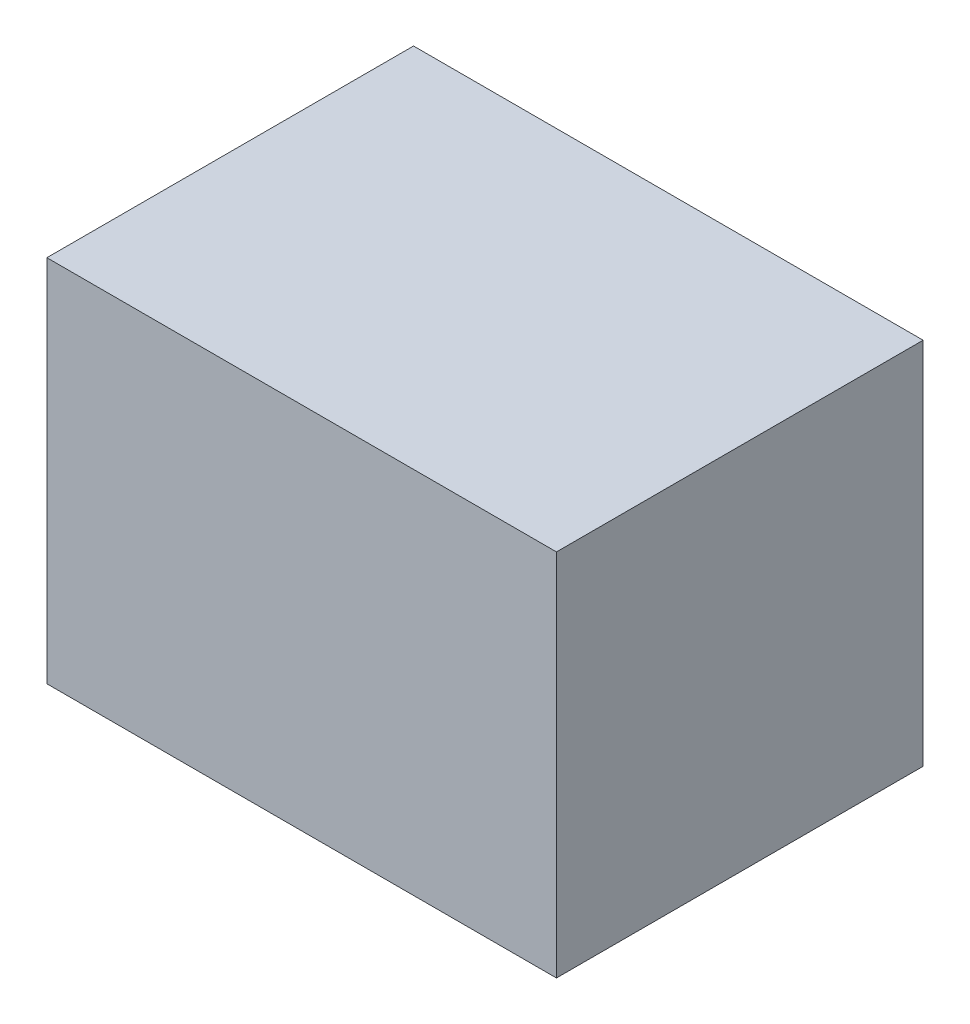
ISO-10303-21;
HEADER;
FILE_DESCRIPTION(('STEP AP214'),'2;1');
FILE_NAME('part.step','',(''),(''),'','','');
FILE_SCHEMA(('AUTOMOTIVE_DESIGN { 1 0 10303 214 1 1 1 1 }'));
ENDSEC;
DATA;
#1=APPLICATION_CONTEXT('core data for automotive mechanical design processes');
#2=APPLICATION_PROTOCOL_DEFINITION('international standard','automotive_design',2000,#1);
#3=PRODUCT_CONTEXT('',#1,'mechanical');
#4=PRODUCT('Part','Part','',(#3));
#5=PRODUCT_RELATED_PRODUCT_CATEGORY('part','',(#4));
#6=PRODUCT_DEFINITION_FORMATION('','',#4);
#7=PRODUCT_DEFINITION_CONTEXT('part definition',#1,'design');
#8=PRODUCT_DEFINITION('design','',#6,#7);
#9=PRODUCT_DEFINITION_SHAPE('','',#8);
#10=(LENGTH_UNIT() NAMED_UNIT(*) SI_UNIT(.MILLI.,.METRE.));
#11=(NAMED_UNIT(*) PLANE_ANGLE_UNIT() SI_UNIT($,.RADIAN.));
#12=(NAMED_UNIT(*) SI_UNIT($,.STERADIAN.) SOLID_ANGLE_UNIT());
#13=UNCERTAINTY_MEASURE_WITH_UNIT(LENGTH_MEASURE(1.E-05),#10,'distance_accuracy_value','');
#14=(GEOMETRIC_REPRESENTATION_CONTEXT(3) GLOBAL_UNCERTAINTY_ASSIGNED_CONTEXT((#13)) GLOBAL_UNIT_ASSIGNED_CONTEXT((#10,
#11,#12)) REPRESENTATION_CONTEXT('',''));
#15=CARTESIAN_POINT('',(0.,0.,0.));
#16=DIRECTION('',(0.,0.,1.));
#17=DIRECTION('',(1.,0.,0.));
#18=AXIS2_PLACEMENT_3D('',#15,#16,#17);
#19=CARTESIAN_POINT('',(-0.3683,-0.2667,0.));
#20=DIRECTION('',(0.,0.,1.));
#21=DIRECTION('',(1.,0.,0.));
#22=AXIS2_PLACEMENT_3D('',#19,#20,#21);
#23=PLANE('',#22);
#24=DIRECTION('',(-1.,0.,0.));
#25=VECTOR('',#24,1.);
#26=CARTESIAN_POINT('',(-0.3683,0.2667,0.));
#27=LINE('',#26,#25);
#28=CARTESIAN_POINT('',(0.3683,0.2667,0.));
#29=VERTEX_POINT('',#28);
#30=CARTESIAN_POINT('',(-0.3683,0.2667,0.));
#31=VERTEX_POINT('',#30);
#32=EDGE_CURVE('E67',#29,#31,#27,.T.);
#33=ORIENTED_EDGE('',*,*,#32,.F.);
#34=DIRECTION('',(0.,1.,0.));
#35=VECTOR('',#34,1.);
#36=CARTESIAN_POINT('',(0.3683,-0.2667,0.));
#37=LINE('',#36,#35);
#38=CARTESIAN_POINT('',(0.3683,-0.2667,0.));
#39=VERTEX_POINT('',#38);
#40=EDGE_CURVE('E61',#39,#29,#37,.T.);
#41=ORIENTED_EDGE('',*,*,#40,.F.);
#42=DIRECTION('',(1.,0.,0.));
#43=VECTOR('',#42,1.);
#44=CARTESIAN_POINT('',(-0.3683,-0.2667,0.));
#45=LINE('',#44,#43);
#46=CARTESIAN_POINT('',(-0.3683,-0.2667,0.));
#47=VERTEX_POINT('',#46);
#48=EDGE_CURVE('E64',#47,#39,#45,.T.);
#49=ORIENTED_EDGE('',*,*,#48,.F.);
#50=DIRECTION('',(0.,-1.,0.));
#51=VECTOR('',#50,1.);
#52=CARTESIAN_POINT('',(-0.3683,-0.2667,0.));
#53=LINE('',#52,#51);
#54=EDGE_CURVE('E11',#31,#47,#53,.T.);
#55=ORIENTED_EDGE('',*,*,#54,.F.);
#56=EDGE_LOOP('',(#33,#41,#49,#55));
#57=FACE_BOUND('',#56,.T.);
#58=ADVANCED_FACE('F16',(#57),#23,.F.);
#59=CARTESIAN_POINT('',(-0.3683,-0.2667,0.));
#60=DIRECTION('',(-1.,0.,0.));
#61=DIRECTION('',(0.,0.,1.));
#62=AXIS2_PLACEMENT_3D('',#59,#60,#61);
#63=PLANE('',#62);
#64=DIRECTION('',(0.,0.,-1.));
#65=VECTOR('',#64,1.);
#66=CARTESIAN_POINT('',(-0.3683,0.2667,0.));
#67=LINE('',#66,#65);
#68=CARTESIAN_POINT('',(-0.3683,0.2667,0.53));
#69=VERTEX_POINT('',#68);
#70=EDGE_CURVE('E27',#69,#31,#67,.T.);
#71=ORIENTED_EDGE('',*,*,#70,.T.);
#72=ORIENTED_EDGE('',*,*,#54,.T.);
#73=DIRECTION('',(0.,0.,1.));
#74=VECTOR('',#73,1.);
#75=CARTESIAN_POINT('',(-0.3683,-0.2667,0.));
#76=LINE('',#75,#74);
#77=CARTESIAN_POINT('',(-0.3683,-0.2667,0.53));
#78=VERTEX_POINT('',#77);
#79=EDGE_CURVE('E20',#47,#78,#76,.T.);
#80=ORIENTED_EDGE('',*,*,#79,.T.);
#81=DIRECTION('',(0.,1.,0.));
#82=VECTOR('',#81,1.);
#83=CARTESIAN_POINT('',(-0.3683,-0.2667,0.53));
#84=LINE('',#83,#82);
#85=EDGE_CURVE('E93',#78,#69,#84,.T.);
#86=ORIENTED_EDGE('',*,*,#85,.T.);
#87=EDGE_LOOP('',(#71,#72,#80,#86));
#88=FACE_BOUND('',#87,.T.);
#89=ADVANCED_FACE('F121',(#88),#63,.T.);
#90=CARTESIAN_POINT('',(-0.3683,0.2667,0.));
#91=DIRECTION('',(0.,1.,0.));
#92=DIRECTION('',(1.,0.,0.));
#93=AXIS2_PLACEMENT_3D('',#90,#91,#92);
#94=PLANE('',#93);
#95=DIRECTION('',(0.,0.,-1.));
#96=VECTOR('',#95,1.);
#97=CARTESIAN_POINT('',(0.3683,0.2667,0.));
#98=LINE('',#97,#96);
#99=CARTESIAN_POINT('',(0.3683,0.2667,0.53));
#100=VERTEX_POINT('',#99);
#101=EDGE_CURVE('E71',#100,#29,#98,.T.);
#102=ORIENTED_EDGE('',*,*,#101,.T.);
#103=ORIENTED_EDGE('',*,*,#32,.T.);
#104=ORIENTED_EDGE('',*,*,#70,.F.);
#105=DIRECTION('',(1.,0.,0.));
#106=VECTOR('',#105,1.);
#107=CARTESIAN_POINT('',(-0.3683,0.2667,0.53));
#108=LINE('',#107,#106);
#109=EDGE_CURVE('E98',#69,#100,#108,.T.);
#110=ORIENTED_EDGE('',*,*,#109,.T.);
#111=EDGE_LOOP('',(#102,#103,#104,#110));
#112=FACE_BOUND('',#111,.T.);
#113=ADVANCED_FACE('F124',(#112),#94,.T.);
#114=CARTESIAN_POINT('',(0.3683,0.2667,0.));
#115=DIRECTION('',(1.,0.,0.));
#116=DIRECTION('',(0.,1.,0.));
#117=AXIS2_PLACEMENT_3D('',#114,#115,#116);
#118=PLANE('',#117);
#119=DIRECTION('',(0.,0.,-1.));
#120=VECTOR('',#119,1.);
#121=CARTESIAN_POINT('',(0.3683,-0.2667,0.));
#122=LINE('',#121,#120);
#123=CARTESIAN_POINT('',(0.3683,-0.2667,0.53));
#124=VERTEX_POINT('',#123);
#125=EDGE_CURVE('E72',#124,#39,#122,.T.);
#126=ORIENTED_EDGE('',*,*,#125,.T.);
#127=ORIENTED_EDGE('',*,*,#40,.T.);
#128=ORIENTED_EDGE('',*,*,#101,.F.);
#129=DIRECTION('',(0.,-1.,0.));
#130=VECTOR('',#129,1.);
#131=CARTESIAN_POINT('',(0.3683,0.2667,0.53));
#132=LINE('',#131,#130);
#133=EDGE_CURVE('E77',#100,#124,#132,.T.);
#134=ORIENTED_EDGE('',*,*,#133,.T.);
#135=EDGE_LOOP('',(#126,#127,#128,#134));
#136=FACE_BOUND('',#135,.T.);
#137=ADVANCED_FACE('F18',(#136),#118,.T.);
#138=CARTESIAN_POINT('',(0.3683,-0.2667,0.));
#139=DIRECTION('',(0.,-1.,0.));
#140=DIRECTION('',(0.,0.,-1.));
#141=AXIS2_PLACEMENT_3D('',#138,#139,#140);
#142=PLANE('',#141);
#143=ORIENTED_EDGE('',*,*,#79,.F.);
#144=ORIENTED_EDGE('',*,*,#48,.T.);
#145=ORIENTED_EDGE('',*,*,#125,.F.);
#146=DIRECTION('',(-1.,0.,0.));
#147=VECTOR('',#146,1.);
#148=CARTESIAN_POINT('',(0.3683,-0.2667,0.53));
#149=LINE('',#148,#147);
#150=EDGE_CURVE('E96',#124,#78,#149,.T.);
#151=ORIENTED_EDGE('',*,*,#150,.T.);
#152=EDGE_LOOP('',(#143,#144,#145,#151));
#153=FACE_BOUND('',#152,.T.);
#154=ADVANCED_FACE('F83',(#153),#142,.T.);
#155=CARTESIAN_POINT('',(-0.3683,-0.2667,0.53));
#156=DIRECTION('',(0.,0.,1.));
#157=DIRECTION('',(1.,0.,0.));
#158=AXIS2_PLACEMENT_3D('',#155,#156,#157);
#159=PLANE('',#158);
#160=ORIENTED_EDGE('',*,*,#109,.F.);
#161=ORIENTED_EDGE('',*,*,#85,.F.);
#162=ORIENTED_EDGE('',*,*,#150,.F.);
#163=ORIENTED_EDGE('',*,*,#133,.F.);
#164=EDGE_LOOP('',(#160,#161,#162,#163));
#165=FACE_BOUND('',#164,.T.);
#166=ADVANCED_FACE('F123',(#165),#159,.T.);
#167=CLOSED_SHELL('',(#58,#89,#113,#137,#154,#166));
#168=MANIFOLD_SOLID_BREP('B1',#167);
#169=ADVANCED_BREP_SHAPE_REPRESENTATION('',(#18,#168),#14);
#170=SHAPE_DEFINITION_REPRESENTATION(#9,#169);
ENDSEC;
END-ISO-10303-21;
